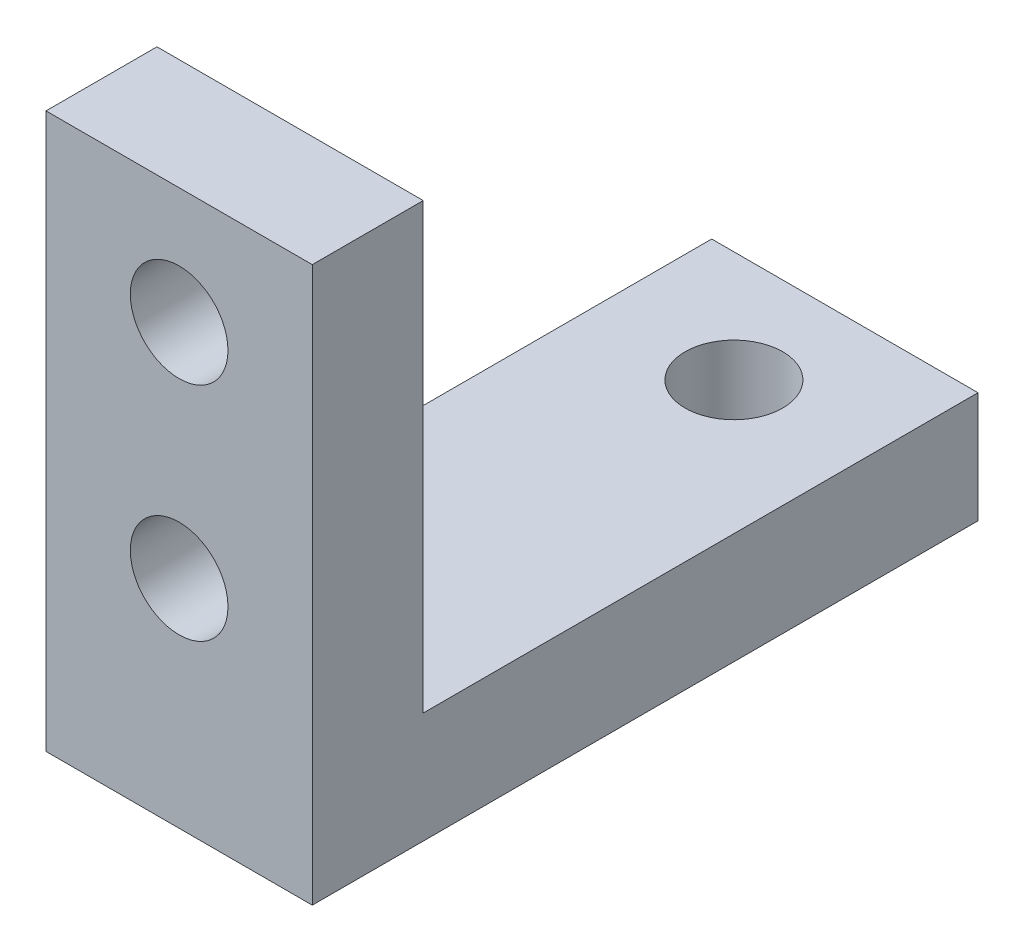
ISO-10303-21;
HEADER;
FILE_DESCRIPTION(('STEP AP214'),'2;1');
FILE_NAME('part.step','',(''),(''),'','','');
FILE_SCHEMA(('AUTOMOTIVE_DESIGN { 1 0 10303 214 1 1 1 1 }'));
ENDSEC;
DATA;
#1=APPLICATION_CONTEXT('core data for automotive mechanical design processes');
#2=APPLICATION_PROTOCOL_DEFINITION('international standard','automotive_design',2000,#1);
#3=PRODUCT_CONTEXT('',#1,'mechanical');
#4=PRODUCT('Part','Part','',(#3));
#5=PRODUCT_RELATED_PRODUCT_CATEGORY('part','',(#4));
#6=PRODUCT_DEFINITION_FORMATION('','',#4);
#7=PRODUCT_DEFINITION_CONTEXT('part definition',#1,'design');
#8=PRODUCT_DEFINITION('design','',#6,#7);
#9=PRODUCT_DEFINITION_SHAPE('','',#8);
#10=(LENGTH_UNIT() NAMED_UNIT(*) SI_UNIT(.MILLI.,.METRE.));
#11=(NAMED_UNIT(*) PLANE_ANGLE_UNIT() SI_UNIT($,.RADIAN.));
#12=(NAMED_UNIT(*) SI_UNIT($,.STERADIAN.) SOLID_ANGLE_UNIT());
#13=UNCERTAINTY_MEASURE_WITH_UNIT(LENGTH_MEASURE(1.E-05),#10,'distance_accuracy_value','');
#14=(GEOMETRIC_REPRESENTATION_CONTEXT(3) GLOBAL_UNCERTAINTY_ASSIGNED_CONTEXT((#13)) GLOBAL_UNIT_ASSIGNED_CONTEXT((#10,
#11,#12)) REPRESENTATION_CONTEXT('',''));
#15=CARTESIAN_POINT('',(0.,0.,0.));
#16=DIRECTION('',(0.,0.,1.));
#17=DIRECTION('',(1.,0.,0.));
#18=AXIS2_PLACEMENT_3D('',#15,#16,#17);
#19=CARTESIAN_POINT('',(12.,0.,0.));
#20=DIRECTION('',(0.,0.,1.));
#21=DIRECTION('',(1.,0.,0.));
#22=AXIS2_PLACEMENT_3D('',#19,#20,#21);
#23=PLANE('',#22);
#24=CARTESIAN_POINT('',(6.,9.75,0.));
#25=DIRECTION('',(0.,0.,1.));
#26=DIRECTION('',(1.,0.,0.));
#27=AXIS2_PLACEMENT_3D('',#24,#25,#26);
#28=CIRCLE('',#27,2.2);
#29=CARTESIAN_POINT('',(8.2,9.75,0.));
#30=VERTEX_POINT('',#29);
#31=EDGE_CURVE('E163',#30,#30,#28,.T.);
#32=ORIENTED_EDGE('',*,*,#31,.F.);
#33=EDGE_LOOP('',(#32));
#34=FACE_BOUND('',#33,.T.);
#35=CARTESIAN_POINT('',(6.,19.7500000000002,0.));
#36=DIRECTION('',(0.,0.,1.));
#37=DIRECTION('',(1.,0.,0.));
#38=AXIS2_PLACEMENT_3D('',#35,#36,#37);
#39=CIRCLE('',#38,2.2);
#40=CARTESIAN_POINT('',(8.2,19.7500000000002,0.));
#41=VERTEX_POINT('',#40);
#42=EDGE_CURVE('E119',#41,#41,#39,.T.);
#43=ORIENTED_EDGE('',*,*,#42,.F.);
#44=EDGE_LOOP('',(#43));
#45=FACE_BOUND('',#44,.T.);
#46=DIRECTION('',(0.,1.,0.));
#47=VECTOR('',#46,1.);
#48=CARTESIAN_POINT('',(0.,0.,0.));
#49=LINE('',#48,#47);
#50=CARTESIAN_POINT('',(0.,0.,0.));
#51=VERTEX_POINT('',#50);
#52=CARTESIAN_POINT('',(0.,25.,0.));
#53=VERTEX_POINT('',#52);
#54=EDGE_CURVE('E116',#51,#53,#49,.T.);
#55=ORIENTED_EDGE('',*,*,#54,.F.);
#56=DIRECTION('',(-1.,0.,0.));
#57=VECTOR('',#56,1.);
#58=CARTESIAN_POINT('',(12.,0.,0.));
#59=LINE('',#58,#57);
#60=CARTESIAN_POINT('',(12.,0.,0.));
#61=VERTEX_POINT('',#60);
#62=EDGE_CURVE('E11',#61,#51,#59,.T.);
#63=ORIENTED_EDGE('',*,*,#62,.F.);
#64=DIRECTION('',(0.,1.,0.));
#65=VECTOR('',#64,1.);
#66=CARTESIAN_POINT('',(12.,0.,0.));
#67=LINE('',#66,#65);
#68=CARTESIAN_POINT('',(12.,25.,0.));
#69=VERTEX_POINT('',#68);
#70=EDGE_CURVE('E130',#61,#69,#67,.T.);
#71=ORIENTED_EDGE('',*,*,#70,.T.);
#72=DIRECTION('',(-1.,0.,0.));
#73=VECTOR('',#72,1.);
#74=CARTESIAN_POINT('',(12.,25.,0.));
#75=LINE('',#74,#73);
#76=EDGE_CURVE('E49',#69,#53,#75,.T.);
#77=ORIENTED_EDGE('',*,*,#76,.T.);
#78=EDGE_LOOP('',(#55,#63,#71,#77));
#79=FACE_BOUND('',#78,.T.);
#80=ADVANCED_FACE('F33',(#34,#45,#79),#23,.T.);
#81=CARTESIAN_POINT('',(12.,0.,0.));
#82=DIRECTION('',(0.,1.,0.));
#83=DIRECTION('',(0.,0.,1.));
#84=AXIS2_PLACEMENT_3D('',#81,#82,#83);
#85=PLANE('',#84);
#86=CARTESIAN_POINT('',(6.,0.,-25.));
#87=DIRECTION('',(0.,-1.,0.));
#88=DIRECTION('',(0.,0.,-1.));
#89=AXIS2_PLACEMENT_3D('',#86,#87,#88);
#90=CIRCLE('',#89,2.2);
#91=CARTESIAN_POINT('',(6.,0.,-27.2));
#92=VERTEX_POINT('',#91);
#93=EDGE_CURVE('E178',#92,#92,#90,.T.);
#94=ORIENTED_EDGE('',*,*,#93,.F.);
#95=EDGE_LOOP('',(#94));
#96=FACE_BOUND('',#95,.T.);
#97=DIRECTION('',(0.,0.,-1.));
#98=VECTOR('',#97,1.);
#99=CARTESIAN_POINT('',(0.,0.,0.));
#100=LINE('',#99,#98);
#101=CARTESIAN_POINT('',(0.,0.,-30.));
#102=VERTEX_POINT('',#101);
#103=EDGE_CURVE('E118',#51,#102,#100,.T.);
#104=ORIENTED_EDGE('',*,*,#103,.T.);
#105=DIRECTION('',(-1.,0.,0.));
#106=VECTOR('',#105,1.);
#107=CARTESIAN_POINT('',(12.,0.,-30.));
#108=LINE('',#107,#106);
#109=CARTESIAN_POINT('',(12.,0.,-30.));
#110=VERTEX_POINT('',#109);
#111=EDGE_CURVE('E41',#110,#102,#108,.T.);
#112=ORIENTED_EDGE('',*,*,#111,.F.);
#113=DIRECTION('',(0.,0.,-1.));
#114=VECTOR('',#113,1.);
#115=CARTESIAN_POINT('',(12.,0.,0.));
#116=LINE('',#115,#114);
#117=EDGE_CURVE('E111',#61,#110,#116,.T.);
#118=ORIENTED_EDGE('',*,*,#117,.F.);
#119=ORIENTED_EDGE('',*,*,#62,.T.);
#120=EDGE_LOOP('',(#104,#112,#118,#119));
#121=FACE_BOUND('',#120,.T.);
#122=ADVANCED_FACE('F154',(#96,#121),#85,.F.);
#123=CARTESIAN_POINT('',(12.,0.,-30.));
#124=DIRECTION('',(0.,0.,1.));
#125=DIRECTION('',(1.,0.,0.));
#126=AXIS2_PLACEMENT_3D('',#123,#124,#125);
#127=PLANE('',#126);
#128=DIRECTION('',(0.,1.,0.));
#129=VECTOR('',#128,1.);
#130=CARTESIAN_POINT('',(0.,0.,-30.));
#131=LINE('',#130,#129);
#132=CARTESIAN_POINT('',(0.,5.,-30.));
#133=VERTEX_POINT('',#132);
#134=EDGE_CURVE('E121',#102,#133,#131,.T.);
#135=ORIENTED_EDGE('',*,*,#134,.T.);
#136=DIRECTION('',(-1.,0.,0.));
#137=VECTOR('',#136,1.);
#138=CARTESIAN_POINT('',(12.,5.,-30.));
#139=LINE('',#138,#137);
#140=CARTESIAN_POINT('',(12.,5.,-30.));
#141=VERTEX_POINT('',#140);
#142=EDGE_CURVE('E97',#141,#133,#139,.T.);
#143=ORIENTED_EDGE('',*,*,#142,.F.);
#144=DIRECTION('',(0.,1.,0.));
#145=VECTOR('',#144,1.);
#146=CARTESIAN_POINT('',(12.,0.,-30.));
#147=LINE('',#146,#145);
#148=EDGE_CURVE('E108',#110,#141,#147,.T.);
#149=ORIENTED_EDGE('',*,*,#148,.F.);
#150=ORIENTED_EDGE('',*,*,#111,.T.);
#151=EDGE_LOOP('',(#135,#143,#149,#150));
#152=FACE_BOUND('',#151,.T.);
#153=ADVANCED_FACE('F137',(#152),#127,.F.);
#154=CARTESIAN_POINT('',(12.,5.,0.));
#155=DIRECTION('',(0.,1.,0.));
#156=DIRECTION('',(0.,0.,1.));
#157=AXIS2_PLACEMENT_3D('',#154,#155,#156);
#158=PLANE('',#157);
#159=CARTESIAN_POINT('',(6.,5.,-25.));
#160=DIRECTION('',(0.,-1.,0.));
#161=DIRECTION('',(0.,0.,-1.));
#162=AXIS2_PLACEMENT_3D('',#159,#160,#161);
#163=CIRCLE('',#162,2.2);
#164=CARTESIAN_POINT('',(6.,5.,-27.2));
#165=VERTEX_POINT('',#164);
#166=EDGE_CURVE('E177',#165,#165,#163,.T.);
#167=ORIENTED_EDGE('',*,*,#166,.T.);
#168=EDGE_LOOP('',(#167));
#169=FACE_BOUND('',#168,.T.);
#170=DIRECTION('',(0.,0.,-1.));
#171=VECTOR('',#170,1.);
#172=CARTESIAN_POINT('',(0.,5.,0.));
#173=LINE('',#172,#171);
#174=CARTESIAN_POINT('',(0.,5.,-5.));
#175=VERTEX_POINT('',#174);
#176=EDGE_CURVE('E94',#175,#133,#173,.T.);
#177=ORIENTED_EDGE('',*,*,#176,.F.);
#178=DIRECTION('',(-1.,0.,0.));
#179=VECTOR('',#178,1.);
#180=CARTESIAN_POINT('',(12.,5.,-5.));
#181=LINE('',#180,#179);
#182=CARTESIAN_POINT('',(12.,5.,-5.));
#183=VERTEX_POINT('',#182);
#184=EDGE_CURVE('E88',#183,#175,#181,.T.);
#185=ORIENTED_EDGE('',*,*,#184,.F.);
#186=DIRECTION('',(0.,0.,-1.));
#187=VECTOR('',#186,1.);
#188=CARTESIAN_POINT('',(12.,5.,0.));
#189=LINE('',#188,#187);
#190=EDGE_CURVE('E92',#183,#141,#189,.T.);
#191=ORIENTED_EDGE('',*,*,#190,.T.);
#192=ORIENTED_EDGE('',*,*,#142,.T.);
#193=EDGE_LOOP('',(#177,#185,#191,#192));
#194=FACE_BOUND('',#193,.T.);
#195=ADVANCED_FACE('F90',(#169,#194),#158,.T.);
#196=CARTESIAN_POINT('',(12.,0.,-5.));
#197=DIRECTION('',(0.,0.,1.));
#198=DIRECTION('',(1.,0.,0.));
#199=AXIS2_PLACEMENT_3D('',#196,#197,#198);
#200=PLANE('',#199);
#201=CARTESIAN_POINT('',(6.,9.75,-5.));
#202=DIRECTION('',(0.,0.,-1.));
#203=DIRECTION('',(-1.,0.,0.));
#204=AXIS2_PLACEMENT_3D('',#201,#202,#203);
#205=CIRCLE('',#204,2.2);
#206=CARTESIAN_POINT('',(3.8,9.75,-5.));
#207=VERTEX_POINT('',#206);
#208=EDGE_CURVE('E174',#207,#207,#205,.T.);
#209=ORIENTED_EDGE('',*,*,#208,.F.);
#210=EDGE_LOOP('',(#209));
#211=FACE_BOUND('',#210,.T.);
#212=CARTESIAN_POINT('',(6.,19.7500000000002,-5.));
#213=DIRECTION('',(0.,0.,-1.));
#214=DIRECTION('',(-1.,0.,0.));
#215=AXIS2_PLACEMENT_3D('',#212,#213,#214);
#216=CIRCLE('',#215,2.2);
#217=CARTESIAN_POINT('',(3.8,19.7500000000002,-5.));
#218=VERTEX_POINT('',#217);
#219=EDGE_CURVE('E167',#218,#218,#216,.T.);
#220=ORIENTED_EDGE('',*,*,#219,.F.);
#221=EDGE_LOOP('',(#220));
#222=FACE_BOUND('',#221,.T.);
#223=DIRECTION('',(0.,1.,0.));
#224=VECTOR('',#223,1.);
#225=CARTESIAN_POINT('',(0.,0.,-5.));
#226=LINE('',#225,#224);
#227=CARTESIAN_POINT('',(0.,25.,-5.));
#228=VERTEX_POINT('',#227);
#229=EDGE_CURVE('E125',#175,#228,#226,.T.);
#230=ORIENTED_EDGE('',*,*,#229,.T.);
#231=DIRECTION('',(-1.,0.,0.));
#232=VECTOR('',#231,1.);
#233=CARTESIAN_POINT('',(12.,25.,-5.));
#234=LINE('',#233,#232);
#235=CARTESIAN_POINT('',(12.,25.,-5.));
#236=VERTEX_POINT('',#235);
#237=EDGE_CURVE('E69',#236,#228,#234,.T.);
#238=ORIENTED_EDGE('',*,*,#237,.F.);
#239=DIRECTION('',(0.,1.,0.));
#240=VECTOR('',#239,1.);
#241=CARTESIAN_POINT('',(12.,0.,-5.));
#242=LINE('',#241,#240);
#243=EDGE_CURVE('E99',#183,#236,#242,.T.);
#244=ORIENTED_EDGE('',*,*,#243,.F.);
#245=ORIENTED_EDGE('',*,*,#184,.T.);
#246=EDGE_LOOP('',(#230,#238,#244,#245));
#247=FACE_BOUND('',#246,.T.);
#248=ADVANCED_FACE('F100',(#211,#222,#247),#200,.F.);
#249=CARTESIAN_POINT('',(12.,25.,0.));
#250=DIRECTION('',(0.,1.,0.));
#251=DIRECTION('',(0.,0.,1.));
#252=AXIS2_PLACEMENT_3D('',#249,#250,#251);
#253=PLANE('',#252);
#254=DIRECTION('',(0.,0.,-1.));
#255=VECTOR('',#254,1.);
#256=CARTESIAN_POINT('',(0.,25.,0.));
#257=LINE('',#256,#255);
#258=EDGE_CURVE('E127',#53,#228,#257,.T.);
#259=ORIENTED_EDGE('',*,*,#258,.F.);
#260=ORIENTED_EDGE('',*,*,#76,.F.);
#261=DIRECTION('',(0.,0.,-1.));
#262=VECTOR('',#261,1.);
#263=CARTESIAN_POINT('',(12.,25.,0.));
#264=LINE('',#263,#262);
#265=EDGE_CURVE('E103',#69,#236,#264,.T.);
#266=ORIENTED_EDGE('',*,*,#265,.T.);
#267=ORIENTED_EDGE('',*,*,#237,.T.);
#268=EDGE_LOOP('',(#259,#260,#266,#267));
#269=FACE_BOUND('',#268,.T.);
#270=ADVANCED_FACE('F142',(#269),#253,.T.);
#271=CARTESIAN_POINT('',(12.,0.,0.));
#272=DIRECTION('',(1.,0.,0.));
#273=DIRECTION('',(0.,0.,-1.));
#274=AXIS2_PLACEMENT_3D('',#271,#272,#273);
#275=PLANE('',#274);
#276=ORIENTED_EDGE('',*,*,#70,.F.);
#277=ORIENTED_EDGE('',*,*,#117,.T.);
#278=ORIENTED_EDGE('',*,*,#148,.T.);
#279=ORIENTED_EDGE('',*,*,#190,.F.);
#280=ORIENTED_EDGE('',*,*,#243,.T.);
#281=ORIENTED_EDGE('',*,*,#265,.F.);
#282=EDGE_LOOP('',(#276,#277,#278,#279,#280,#281));
#283=FACE_BOUND('',#282,.T.);
#284=ADVANCED_FACE('F106',(#283),#275,.T.);
#285=CARTESIAN_POINT('',(0.,0.,0.));
#286=DIRECTION('',(1.,0.,0.));
#287=DIRECTION('',(0.,0.,-1.));
#288=AXIS2_PLACEMENT_3D('',#285,#286,#287);
#289=PLANE('',#288);
#290=ORIENTED_EDGE('',*,*,#54,.T.);
#291=ORIENTED_EDGE('',*,*,#258,.T.);
#292=ORIENTED_EDGE('',*,*,#229,.F.);
#293=ORIENTED_EDGE('',*,*,#176,.T.);
#294=ORIENTED_EDGE('',*,*,#134,.F.);
#295=ORIENTED_EDGE('',*,*,#103,.F.);
#296=EDGE_LOOP('',(#290,#291,#292,#293,#294,#295));
#297=FACE_BOUND('',#296,.T.);
#298=ADVANCED_FACE('F141',(#297),#289,.F.);
#299=CARTESIAN_POINT('',(6.,19.7500000000002,7.));
#300=DIRECTION('',(0.,0.,-1.));
#301=DIRECTION('',(-1.,0.,0.));
#302=AXIS2_PLACEMENT_3D('',#299,#300,#301);
#303=CYLINDRICAL_SURFACE('',#302,2.2);
#304=ORIENTED_EDGE('',*,*,#42,.T.);
#305=EDGE_LOOP('',(#304));
#306=FACE_BOUND('',#305,.T.);
#307=ORIENTED_EDGE('',*,*,#219,.T.);
#308=EDGE_LOOP('',(#307));
#309=FACE_BOUND('',#308,.T.);
#310=ADVANCED_FACE('F194',(#306,#309),#303,.F.);
#311=CARTESIAN_POINT('',(6.,9.75,7.));
#312=DIRECTION('',(0.,0.,-1.));
#313=DIRECTION('',(-1.,0.,0.));
#314=AXIS2_PLACEMENT_3D('',#311,#312,#313);
#315=CYLINDRICAL_SURFACE('',#314,2.2);
#316=ORIENTED_EDGE('',*,*,#31,.T.);
#317=EDGE_LOOP('',(#316));
#318=FACE_BOUND('',#317,.T.);
#319=ORIENTED_EDGE('',*,*,#208,.T.);
#320=EDGE_LOOP('',(#319));
#321=FACE_BOUND('',#320,.T.);
#322=ADVANCED_FACE('F188',(#318,#321),#315,.F.);
#323=CARTESIAN_POINT('',(6.,5.,-25.));
#324=DIRECTION('',(0.,-1.,0.));
#325=DIRECTION('',(0.,0.,-1.));
#326=AXIS2_PLACEMENT_3D('',#323,#324,#325);
#327=CYLINDRICAL_SURFACE('',#326,2.2);
#328=ORIENTED_EDGE('',*,*,#166,.F.);
#329=EDGE_LOOP('',(#328));
#330=FACE_BOUND('',#329,.T.);
#331=ORIENTED_EDGE('',*,*,#93,.T.);
#332=EDGE_LOOP('',(#331));
#333=FACE_BOUND('',#332,.T.);
#334=ADVANCED_FACE('F185',(#330,#333),#327,.F.);
#335=CLOSED_SHELL('',(#80,#122,#153,#195,#248,#270,#284,#298,#310,#322,#334));
#336=MANIFOLD_SOLID_BREP('B2',#335);
#337=ADVANCED_BREP_SHAPE_REPRESENTATION('',(#18,#336),#14);
#338=SHAPE_DEFINITION_REPRESENTATION(#9,#337);
ENDSEC;
END-ISO-10303-21;
